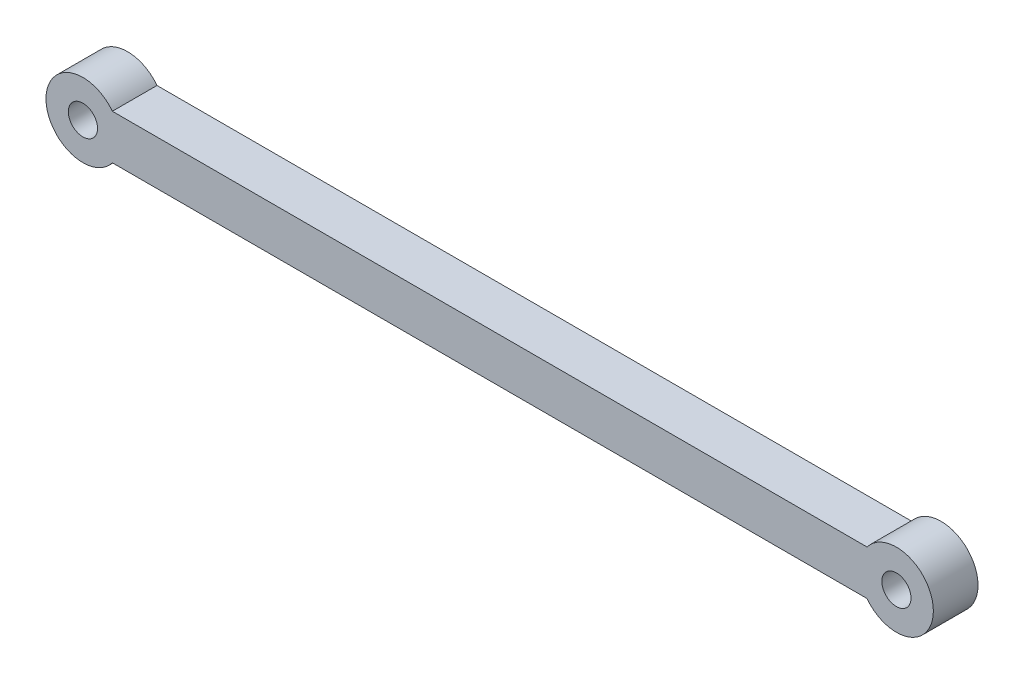
ISO-10303-21;
HEADER;
FILE_DESCRIPTION(('STEP AP214'),'2;1');
FILE_NAME('part.step','',(''),(''),'','','');
FILE_SCHEMA(('AUTOMOTIVE_DESIGN { 1 0 10303 214 1 1 1 1 }'));
ENDSEC;
DATA;
#1=APPLICATION_CONTEXT('core data for automotive mechanical design processes');
#2=APPLICATION_PROTOCOL_DEFINITION('international standard','automotive_design',2000,#1);
#3=PRODUCT_CONTEXT('',#1,'mechanical');
#4=PRODUCT('Part','Part','',(#3));
#5=PRODUCT_RELATED_PRODUCT_CATEGORY('part','',(#4));
#6=PRODUCT_DEFINITION_FORMATION('','',#4);
#7=PRODUCT_DEFINITION_CONTEXT('part definition',#1,'design');
#8=PRODUCT_DEFINITION('design','',#6,#7);
#9=PRODUCT_DEFINITION_SHAPE('','',#8);
#10=(LENGTH_UNIT() NAMED_UNIT(*) SI_UNIT(.MILLI.,.METRE.));
#11=(NAMED_UNIT(*) PLANE_ANGLE_UNIT() SI_UNIT($,.RADIAN.));
#12=(NAMED_UNIT(*) SI_UNIT($,.STERADIAN.) SOLID_ANGLE_UNIT());
#13=UNCERTAINTY_MEASURE_WITH_UNIT(LENGTH_MEASURE(1.E-05),#10,'distance_accuracy_value','');
#14=(GEOMETRIC_REPRESENTATION_CONTEXT(3) GLOBAL_UNCERTAINTY_ASSIGNED_CONTEXT((#13)) GLOBAL_UNIT_ASSIGNED_CONTEXT((#10,
#11,#12)) REPRESENTATION_CONTEXT('',''));
#15=CARTESIAN_POINT('',(0.,0.,0.));
#16=DIRECTION('',(0.,0.,1.));
#17=DIRECTION('',(1.,0.,0.));
#18=AXIS2_PLACEMENT_3D('',#15,#16,#17);
#19=CARTESIAN_POINT('',(-610.888476575822,10.97625,10.97625));
#20=DIRECTION('',(0.,1.,0.));
#21=DIRECTION('',(0.,0.,1.));
#22=AXIS2_PLACEMENT_3D('',#19,#20,#21);
#23=PLANE('',#22);
#24=DIRECTION('',(1.,0.,0.));
#25=VECTOR('',#24,1.);
#26=CARTESIAN_POINT('',(-610.888476575822,10.97625,-10.97625));
#27=LINE('',#26,#25);
#28=CARTESIAN_POINT('',(-610.888476575822,10.97625,-10.97625));
#29=VERTEX_POINT('',#28);
#30=CARTESIAN_POINT('',(-239.815748776291,10.97625,-10.97625));
#31=VERTEX_POINT('',#30);
#32=EDGE_CURVE('E141',#29,#31,#27,.T.);
#33=ORIENTED_EDGE('',*,*,#32,.F.);
#34=DIRECTION('',(0.,0.,-1.));
#35=VECTOR('',#34,1.);
#36=CARTESIAN_POINT('',(-610.888476575822,10.97625,10.97625));
#37=LINE('',#36,#35);
#38=CARTESIAN_POINT('',(-610.888476575822,10.97625,10.97625));
#39=VERTEX_POINT('',#38);
#40=EDGE_CURVE('E95',#39,#29,#37,.T.);
#41=ORIENTED_EDGE('',*,*,#40,.F.);
#42=DIRECTION('',(1.,0.,0.));
#43=VECTOR('',#42,1.);
#44=CARTESIAN_POINT('',(-610.888476575822,10.97625,10.97625));
#45=LINE('',#44,#43);
#46=CARTESIAN_POINT('',(-239.815748776291,10.97625,10.97625));
#47=VERTEX_POINT('',#46);
#48=EDGE_CURVE('E140',#39,#47,#45,.T.);
#49=ORIENTED_EDGE('',*,*,#48,.T.);
#50=DIRECTION('',(0.,0.,-1.));
#51=VECTOR('',#50,1.);
#52=CARTESIAN_POINT('',(-239.815748776291,10.97625,10.97625));
#53=LINE('',#52,#51);
#54=EDGE_CURVE('E108',#47,#31,#53,.T.);
#55=ORIENTED_EDGE('',*,*,#54,.T.);
#56=EDGE_LOOP('',(#33,#41,#49,#55));
#57=FACE_BOUND('',#56,.T.);
#58=ADVANCED_FACE('F75',(#57),#23,.T.);
#59=CARTESIAN_POINT('',(-610.888476575822,-10.97625,10.97625));
#60=DIRECTION('',(0.,1.,0.));
#61=DIRECTION('',(0.,0.,1.));
#62=AXIS2_PLACEMENT_3D('',#59,#60,#61);
#63=PLANE('',#62);
#64=DIRECTION('',(1.,0.,0.));
#65=VECTOR('',#64,1.);
#66=CARTESIAN_POINT('',(-610.888476575822,-10.97625,-10.97625));
#67=LINE('',#66,#65);
#68=CARTESIAN_POINT('',(-610.888476575822,-10.97625,-10.97625));
#69=VERTEX_POINT('',#68);
#70=CARTESIAN_POINT('',(-239.815748776291,-10.97625,-10.97625));
#71=VERTEX_POINT('',#70);
#72=EDGE_CURVE('E126',#69,#71,#67,.T.);
#73=ORIENTED_EDGE('',*,*,#72,.T.);
#74=DIRECTION('',(0.,0.,-1.));
#75=VECTOR('',#74,1.);
#76=CARTESIAN_POINT('',(-239.815748776291,-10.97625,10.97625));
#77=LINE('',#76,#75);
#78=CARTESIAN_POINT('',(-239.815748776291,-10.97625,10.97625));
#79=VERTEX_POINT('',#78);
#80=EDGE_CURVE('E86',#79,#71,#77,.T.);
#81=ORIENTED_EDGE('',*,*,#80,.F.);
#82=DIRECTION('',(1.,0.,0.));
#83=VECTOR('',#82,1.);
#84=CARTESIAN_POINT('',(-610.888476575822,-10.97625,10.97625));
#85=LINE('',#84,#83);
#86=CARTESIAN_POINT('',(-610.888476575822,-10.97625,10.97625));
#87=VERTEX_POINT('',#86);
#88=EDGE_CURVE('E124',#87,#79,#85,.T.);
#89=ORIENTED_EDGE('',*,*,#88,.F.);
#90=DIRECTION('',(0.,0.,-1.));
#91=VECTOR('',#90,1.);
#92=CARTESIAN_POINT('',(-610.888476575822,-10.97625,10.97625));
#93=LINE('',#92,#91);
#94=EDGE_CURVE('E12',#87,#69,#93,.T.);
#95=ORIENTED_EDGE('',*,*,#94,.T.);
#96=EDGE_LOOP('',(#73,#81,#89,#95));
#97=FACE_BOUND('',#96,.T.);
#98=ADVANCED_FACE('F122',(#97),#63,.F.);
#99=CARTESIAN_POINT('',(0.,0.,-10.97625));
#100=DIRECTION('',(0.,0.,1.));
#101=DIRECTION('',(1.,0.,0.));
#102=AXIS2_PLACEMENT_3D('',#99,#100,#101);
#103=PLANE('',#102);
#104=CARTESIAN_POINT('',(-625.352112676056,0.,-10.97625));
#105=DIRECTION('',(0.,0.,1.));
#106=DIRECTION('',(1.,0.,0.));
#107=AXIS2_PLACEMENT_3D('',#104,#105,#106);
#108=CIRCLE('',#107,7.1807);
#109=CARTESIAN_POINT('',(-618.171412676056,0.,-10.97625));
#110=VERTEX_POINT('',#109);
#111=EDGE_CURVE('E165',#110,#110,#108,.T.);
#112=ORIENTED_EDGE('',*,*,#111,.T.);
#113=EDGE_LOOP('',(#112));
#114=FACE_BOUND('',#113,.T.);
#115=CARTESIAN_POINT('',(-225.352112676056,0.,-10.97625));
#116=DIRECTION('',(0.,0.,1.));
#117=DIRECTION('',(1.,0.,0.));
#118=AXIS2_PLACEMENT_3D('',#115,#116,#117);
#119=CIRCLE('',#118,7.18069999999999);
#120=CARTESIAN_POINT('',(-218.171412676056,0.,-10.97625));
#121=VERTEX_POINT('',#120);
#122=EDGE_CURVE('E149',#121,#121,#119,.T.);
#123=ORIENTED_EDGE('',*,*,#122,.T.);
#124=EDGE_LOOP('',(#123));
#125=FACE_BOUND('',#124,.T.);
#126=ORIENTED_EDGE('',*,*,#72,.F.);
#127=CARTESIAN_POINT('',(-625.352112676056,0.,-10.97625));
#128=DIRECTION('',(0.,0.,1.));
#129=DIRECTION('',(1.,0.,0.));
#130=AXIS2_PLACEMENT_3D('',#127,#128,#129);
#131=CIRCLE('',#130,18.1569499999999);
#132=EDGE_CURVE('E136',#29,#69,#131,.T.);
#133=ORIENTED_EDGE('',*,*,#132,.F.);
#134=ORIENTED_EDGE('',*,*,#32,.T.);
#135=CARTESIAN_POINT('',(-225.352112676056,0.,-10.97625));
#136=DIRECTION('',(0.,0.,1.));
#137=DIRECTION('',(1.,0.,0.));
#138=AXIS2_PLACEMENT_3D('',#135,#136,#137);
#139=CIRCLE('',#138,18.1569499999999);
#140=EDGE_CURVE('E79',#71,#31,#139,.T.);
#141=ORIENTED_EDGE('',*,*,#140,.F.);
#142=EDGE_LOOP('',(#126,#133,#134,#141));
#143=FACE_BOUND('',#142,.T.);
#144=ADVANCED_FACE('F163',(#114,#125,#143),#103,.F.);
#145=CARTESIAN_POINT('',(0.,0.,10.97625));
#146=DIRECTION('',(0.,0.,1.));
#147=DIRECTION('',(1.,0.,0.));
#148=AXIS2_PLACEMENT_3D('',#145,#146,#147);
#149=PLANE('',#148);
#150=CARTESIAN_POINT('',(-625.352112676056,0.,10.97625));
#151=DIRECTION('',(0.,0.,1.));
#152=DIRECTION('',(1.,0.,0.));
#153=AXIS2_PLACEMENT_3D('',#150,#151,#152);
#154=CIRCLE('',#153,7.1807);
#155=CARTESIAN_POINT('',(-618.171412676056,0.,10.97625));
#156=VERTEX_POINT('',#155);
#157=EDGE_CURVE('E168',#156,#156,#154,.T.);
#158=ORIENTED_EDGE('',*,*,#157,.F.);
#159=EDGE_LOOP('',(#158));
#160=FACE_BOUND('',#159,.T.);
#161=CARTESIAN_POINT('',(-225.352112676056,0.,10.97625));
#162=DIRECTION('',(0.,0.,1.));
#163=DIRECTION('',(1.,0.,0.));
#164=AXIS2_PLACEMENT_3D('',#161,#162,#163);
#165=CIRCLE('',#164,7.18069999999999);
#166=CARTESIAN_POINT('',(-218.171412676056,0.,10.97625));
#167=VERTEX_POINT('',#166);
#168=EDGE_CURVE('E174',#167,#167,#165,.T.);
#169=ORIENTED_EDGE('',*,*,#168,.F.);
#170=EDGE_LOOP('',(#169));
#171=FACE_BOUND('',#170,.T.);
#172=ORIENTED_EDGE('',*,*,#48,.F.);
#173=CARTESIAN_POINT('',(-625.352112676056,0.,10.97625));
#174=DIRECTION('',(0.,0.,1.));
#175=DIRECTION('',(1.,0.,0.));
#176=AXIS2_PLACEMENT_3D('',#173,#174,#175);
#177=CIRCLE('',#176,18.1569499999999);
#178=EDGE_CURVE('E138',#39,#87,#177,.T.);
#179=ORIENTED_EDGE('',*,*,#178,.T.);
#180=ORIENTED_EDGE('',*,*,#88,.T.);
#181=CARTESIAN_POINT('',(-225.352112676056,0.,10.97625));
#182=DIRECTION('',(0.,0.,1.));
#183=DIRECTION('',(1.,0.,0.));
#184=AXIS2_PLACEMENT_3D('',#181,#182,#183);
#185=CIRCLE('',#184,18.1569499999999);
#186=EDGE_CURVE('E132',#79,#47,#185,.T.);
#187=ORIENTED_EDGE('',*,*,#186,.T.);
#188=EDGE_LOOP('',(#172,#179,#180,#187));
#189=FACE_BOUND('',#188,.T.);
#190=ADVANCED_FACE('F137',(#160,#171,#189),#149,.T.);
#191=CARTESIAN_POINT('',(-225.352112676056,0.,10.97625));
#192=DIRECTION('',(0.,0.,-1.));
#193=DIRECTION('',(-1.,0.,0.));
#194=AXIS2_PLACEMENT_3D('',#191,#192,#193);
#195=CYLINDRICAL_SURFACE('',#194,18.1569499999999);
#196=ORIENTED_EDGE('',*,*,#80,.T.);
#197=ORIENTED_EDGE('',*,*,#140,.T.);
#198=ORIENTED_EDGE('',*,*,#54,.F.);
#199=ORIENTED_EDGE('',*,*,#186,.F.);
#200=EDGE_LOOP('',(#196,#197,#198,#199));
#201=FACE_BOUND('',#200,.T.);
#202=ADVANCED_FACE('F77',(#201),#195,.T.);
#203=CARTESIAN_POINT('',(-625.352112676056,0.,10.97625));
#204=DIRECTION('',(0.,0.,-1.));
#205=DIRECTION('',(-1.,0.,0.));
#206=AXIS2_PLACEMENT_3D('',#203,#204,#205);
#207=CYLINDRICAL_SURFACE('',#206,18.1569499999999);
#208=ORIENTED_EDGE('',*,*,#132,.T.);
#209=ORIENTED_EDGE('',*,*,#94,.F.);
#210=ORIENTED_EDGE('',*,*,#178,.F.);
#211=ORIENTED_EDGE('',*,*,#40,.T.);
#212=EDGE_LOOP('',(#208,#209,#210,#211));
#213=FACE_BOUND('',#212,.T.);
#214=ADVANCED_FACE('F161',(#213),#207,.T.);
#215=CARTESIAN_POINT('',(-225.352112676056,0.,-10.97625));
#216=DIRECTION('',(0.,0.,1.));
#217=DIRECTION('',(1.,0.,0.));
#218=AXIS2_PLACEMENT_3D('',#215,#216,#217);
#219=CYLINDRICAL_SURFACE('',#218,7.18069999999999);
#220=CARTESIAN_POINT('',(-218.171412676056,0.,-10.97625));
#221=CARTESIAN_POINT('',(-218.171412676056,0.,-10.747578125));
#222=CARTESIAN_POINT('',(-218.171412676056,0.,-10.51890625));
#223=CARTESIAN_POINT('',(-218.171412676056,0.,-10.0615625));
#224=CARTESIAN_POINT('',(-218.171412676056,0.,-9.832890625));
#225=CARTESIAN_POINT('',(-218.171412676056,0.,-9.375546875));
#226=CARTESIAN_POINT('',(-218.171412676056,0.,-9.146875));
#227=CARTESIAN_POINT('',(-218.171412676056,0.,-8.68953125));
#228=CARTESIAN_POINT('',(-218.171412676056,0.,-8.460859375));
#229=CARTESIAN_POINT('',(-218.171412676056,0.,-8.003515625));
#230=CARTESIAN_POINT('',(-218.171412676056,0.,-7.77484375));
#231=CARTESIAN_POINT('',(-218.171412676056,0.,-7.3175));
#232=CARTESIAN_POINT('',(-218.171412676056,0.,-7.088828125));
#233=CARTESIAN_POINT('',(-218.171412676056,0.,-6.631484375));
#234=CARTESIAN_POINT('',(-218.171412676056,0.,-6.4028125));
#235=CARTESIAN_POINT('',(-218.171412676056,0.,-5.94546875));
#236=CARTESIAN_POINT('',(-218.171412676056,0.,-5.716796875));
#237=CARTESIAN_POINT('',(-218.171412676056,0.,-5.259453125));
#238=CARTESIAN_POINT('',(-218.171412676056,0.,-5.03078125));
#239=CARTESIAN_POINT('',(-218.171412676056,0.,-4.5734375));
#240=CARTESIAN_POINT('',(-218.171412676056,0.,-4.344765625));
#241=CARTESIAN_POINT('',(-218.171412676056,0.,-3.887421875));
#242=CARTESIAN_POINT('',(-218.171412676056,0.,-3.65875));
#243=CARTESIAN_POINT('',(-218.171412676056,0.,-3.20140625));
#244=CARTESIAN_POINT('',(-218.171412676056,0.,-2.972734375));
#245=CARTESIAN_POINT('',(-218.171412676056,0.,-2.515390625));
#246=CARTESIAN_POINT('',(-218.171412676056,0.,-2.28671875));
#247=CARTESIAN_POINT('',(-218.171412676056,0.,-1.829375));
#248=CARTESIAN_POINT('',(-218.171412676056,0.,-1.600703125));
#249=CARTESIAN_POINT('',(-218.171412676056,0.,-1.143359375));
#250=CARTESIAN_POINT('',(-218.171412676056,0.,-0.914687500000001));
#251=CARTESIAN_POINT('',(-218.171412676056,0.,-0.457343750000001));
#252=CARTESIAN_POINT('',(-218.171412676056,0.,-0.228671875000002));
#253=CARTESIAN_POINT('',(-218.171412676056,0.,0.228671874999998));
#254=CARTESIAN_POINT('',(-218.171412676056,0.,0.457343749999998));
#255=CARTESIAN_POINT('',(-218.171412676056,0.,0.914687499999998));
#256=CARTESIAN_POINT('',(-218.171412676056,0.,1.143359375));
#257=CARTESIAN_POINT('',(-218.171412676056,0.,1.600703125));
#258=CARTESIAN_POINT('',(-218.171412676056,0.,1.829375));
#259=CARTESIAN_POINT('',(-218.171412676056,0.,2.28671875));
#260=CARTESIAN_POINT('',(-218.171412676056,0.,2.515390625));
#261=CARTESIAN_POINT('',(-218.171412676056,0.,2.972734375));
#262=CARTESIAN_POINT('',(-218.171412676056,0.,3.20140625));
#263=CARTESIAN_POINT('',(-218.171412676056,0.,3.65875));
#264=CARTESIAN_POINT('',(-218.171412676056,0.,3.887421875));
#265=CARTESIAN_POINT('',(-218.171412676056,0.,4.344765625));
#266=CARTESIAN_POINT('',(-218.171412676056,0.,4.5734375));
#267=CARTESIAN_POINT('',(-218.171412676056,0.,5.03078125));
#268=CARTESIAN_POINT('',(-218.171412676056,0.,5.259453125));
#269=CARTESIAN_POINT('',(-218.171412676056,0.,5.716796875));
#270=CARTESIAN_POINT('',(-218.171412676056,0.,5.94546875));
#271=CARTESIAN_POINT('',(-218.171412676056,0.,6.4028125));
#272=CARTESIAN_POINT('',(-218.171412676056,0.,6.631484375));
#273=CARTESIAN_POINT('',(-218.171412676056,0.,7.088828125));
#274=CARTESIAN_POINT('',(-218.171412676056,0.,7.3175));
#275=CARTESIAN_POINT('',(-218.171412676056,0.,7.77484375));
#276=CARTESIAN_POINT('',(-218.171412676056,0.,8.003515625));
#277=CARTESIAN_POINT('',(-218.171412676056,0.,8.460859375));
#278=CARTESIAN_POINT('',(-218.171412676056,0.,8.68953125));
#279=CARTESIAN_POINT('',(-218.171412676056,0.,9.146875));
#280=CARTESIAN_POINT('',(-218.171412676056,0.,9.375546875));
#281=CARTESIAN_POINT('',(-218.171412676056,0.,9.832890625));
#282=CARTESIAN_POINT('',(-218.171412676056,0.,10.0615625));
#283=CARTESIAN_POINT('',(-218.171412676056,0.,10.51890625));
#284=CARTESIAN_POINT('',(-218.171412676056,0.,10.747578125));
#285=CARTESIAN_POINT('',(-218.171412676056,0.,10.97625));
#286=B_SPLINE_CURVE_WITH_KNOTS('',3,(#220,#221,#222,#223,#224,#225,#226,#227,#228,#229,#230,
#231,#232,#233,#234,#235,#236,#237,#238,#239,#240,#241,#242,#243,#244,#245,#246,#247,#248,#249,
#250,#251,#252,#253,#254,#255,#256,#257,#258,#259,#260,#261,#262,#263,#264,#265,#266,#267,#268,
#269,#270,#271,#272,#273,#274,#275,#276,#277,#278,#279,#280,#281,#282,#283,#284,#285),
.UNSPECIFIED.,.F.,.F.,(4,2,2,2,2,2,2,2,2,2,2,2,2,2,2,2,2,2,2,2,2,2,2,2,2,2,2,2,2,2,2,2,4),(0.,
0.686015625,1.37203125,2.058046875,2.7440625,3.430078125,4.11609375,4.802109375,5.488125,
6.174140625,6.86015625,7.546171875,8.2321875,8.918203125,9.60421875,10.290234375,10.97625,
11.662265625,12.34828125,13.034296875,13.7203125,14.406328125,15.09234375,15.778359375,
16.464375,17.150390625,17.83640625,18.522421875,19.2084375,19.894453125,20.58046875,
21.266484375,21.9525),.UNSPECIFIED.);
#287=EDGE_CURVE('BSEAM185',#121,#167,#286,.T.);
#288=ORIENTED_EDGE('',*,*,#122,.F.);
#289=ORIENTED_EDGE('',*,*,#168,.T.);
#290=ORIENTED_EDGE('',*,*,#287,.T.);
#291=ORIENTED_EDGE('',*,*,#287,.F.);
#292=EDGE_LOOP('',(#288,#290,#289,#291));
#293=FACE_BOUND('',#292,.T.);
#294=ADVANCED_FACE('F185',(#293),#219,.F.);
#295=CARTESIAN_POINT('',(-625.352112676056,0.,-10.97625));
#296=DIRECTION('',(0.,0.,1.));
#297=DIRECTION('',(1.,0.,0.));
#298=AXIS2_PLACEMENT_3D('',#295,#296,#297);
#299=CYLINDRICAL_SURFACE('',#298,7.1807);
#300=CARTESIAN_POINT('',(-618.171412676056,0.,-10.97625));
#301=CARTESIAN_POINT('',(-618.171412676056,0.,-10.747578125));
#302=CARTESIAN_POINT('',(-618.171412676056,0.,-10.51890625));
#303=CARTESIAN_POINT('',(-618.171412676056,0.,-10.0615625));
#304=CARTESIAN_POINT('',(-618.171412676056,0.,-9.832890625));
#305=CARTESIAN_POINT('',(-618.171412676056,0.,-9.375546875));
#306=CARTESIAN_POINT('',(-618.171412676056,0.,-9.146875));
#307=CARTESIAN_POINT('',(-618.171412676056,0.,-8.68953125));
#308=CARTESIAN_POINT('',(-618.171412676056,0.,-8.460859375));
#309=CARTESIAN_POINT('',(-618.171412676056,0.,-8.003515625));
#310=CARTESIAN_POINT('',(-618.171412676056,0.,-7.77484375));
#311=CARTESIAN_POINT('',(-618.171412676056,0.,-7.3175));
#312=CARTESIAN_POINT('',(-618.171412676056,0.,-7.088828125));
#313=CARTESIAN_POINT('',(-618.171412676056,0.,-6.631484375));
#314=CARTESIAN_POINT('',(-618.171412676056,0.,-6.4028125));
#315=CARTESIAN_POINT('',(-618.171412676056,0.,-5.94546875));
#316=CARTESIAN_POINT('',(-618.171412676056,0.,-5.716796875));
#317=CARTESIAN_POINT('',(-618.171412676056,0.,-5.259453125));
#318=CARTESIAN_POINT('',(-618.171412676056,0.,-5.03078125));
#319=CARTESIAN_POINT('',(-618.171412676056,0.,-4.5734375));
#320=CARTESIAN_POINT('',(-618.171412676056,0.,-4.344765625));
#321=CARTESIAN_POINT('',(-618.171412676056,0.,-3.887421875));
#322=CARTESIAN_POINT('',(-618.171412676056,0.,-3.65875));
#323=CARTESIAN_POINT('',(-618.171412676056,0.,-3.20140625));
#324=CARTESIAN_POINT('',(-618.171412676056,0.,-2.972734375));
#325=CARTESIAN_POINT('',(-618.171412676056,0.,-2.515390625));
#326=CARTESIAN_POINT('',(-618.171412676056,0.,-2.28671875));
#327=CARTESIAN_POINT('',(-618.171412676056,0.,-1.829375));
#328=CARTESIAN_POINT('',(-618.171412676056,0.,-1.600703125));
#329=CARTESIAN_POINT('',(-618.171412676056,0.,-1.143359375));
#330=CARTESIAN_POINT('',(-618.171412676056,0.,-0.914687500000001));
#331=CARTESIAN_POINT('',(-618.171412676056,0.,-0.457343750000001));
#332=CARTESIAN_POINT('',(-618.171412676056,0.,-0.228671875000002));
#333=CARTESIAN_POINT('',(-618.171412676056,0.,0.228671874999998));
#334=CARTESIAN_POINT('',(-618.171412676056,0.,0.457343749999998));
#335=CARTESIAN_POINT('',(-618.171412676056,0.,0.914687499999998));
#336=CARTESIAN_POINT('',(-618.171412676056,0.,1.143359375));
#337=CARTESIAN_POINT('',(-618.171412676056,0.,1.600703125));
#338=CARTESIAN_POINT('',(-618.171412676056,0.,1.829375));
#339=CARTESIAN_POINT('',(-618.171412676056,0.,2.28671875));
#340=CARTESIAN_POINT('',(-618.171412676056,0.,2.515390625));
#341=CARTESIAN_POINT('',(-618.171412676056,0.,2.972734375));
#342=CARTESIAN_POINT('',(-618.171412676056,0.,3.20140625));
#343=CARTESIAN_POINT('',(-618.171412676056,0.,3.65875));
#344=CARTESIAN_POINT('',(-618.171412676056,0.,3.887421875));
#345=CARTESIAN_POINT('',(-618.171412676056,0.,4.344765625));
#346=CARTESIAN_POINT('',(-618.171412676056,0.,4.5734375));
#347=CARTESIAN_POINT('',(-618.171412676056,0.,5.03078125));
#348=CARTESIAN_POINT('',(-618.171412676056,0.,5.259453125));
#349=CARTESIAN_POINT('',(-618.171412676056,0.,5.716796875));
#350=CARTESIAN_POINT('',(-618.171412676056,0.,5.94546875));
#351=CARTESIAN_POINT('',(-618.171412676056,0.,6.4028125));
#352=CARTESIAN_POINT('',(-618.171412676056,0.,6.631484375));
#353=CARTESIAN_POINT('',(-618.171412676056,0.,7.088828125));
#354=CARTESIAN_POINT('',(-618.171412676056,0.,7.3175));
#355=CARTESIAN_POINT('',(-618.171412676056,0.,7.77484375));
#356=CARTESIAN_POINT('',(-618.171412676056,0.,8.003515625));
#357=CARTESIAN_POINT('',(-618.171412676056,0.,8.460859375));
#358=CARTESIAN_POINT('',(-618.171412676056,0.,8.68953125));
#359=CARTESIAN_POINT('',(-618.171412676056,0.,9.146875));
#360=CARTESIAN_POINT('',(-618.171412676056,0.,9.375546875));
#361=CARTESIAN_POINT('',(-618.171412676056,0.,9.832890625));
#362=CARTESIAN_POINT('',(-618.171412676056,0.,10.0615625));
#363=CARTESIAN_POINT('',(-618.171412676056,0.,10.51890625));
#364=CARTESIAN_POINT('',(-618.171412676056,0.,10.747578125));
#365=CARTESIAN_POINT('',(-618.171412676056,0.,10.97625));
#366=B_SPLINE_CURVE_WITH_KNOTS('',3,(#300,#301,#302,#303,#304,#305,#306,#307,#308,#309,#310,
#311,#312,#313,#314,#315,#316,#317,#318,#319,#320,#321,#322,#323,#324,#325,#326,#327,#328,#329,
#330,#331,#332,#333,#334,#335,#336,#337,#338,#339,#340,#341,#342,#343,#344,#345,#346,#347,#348,
#349,#350,#351,#352,#353,#354,#355,#356,#357,#358,#359,#360,#361,#362,#363,#364,#365),
.UNSPECIFIED.,.F.,.F.,(4,2,2,2,2,2,2,2,2,2,2,2,2,2,2,2,2,2,2,2,2,2,2,2,2,2,2,2,2,2,2,2,4),(0.,
0.686015625,1.37203125,2.058046875,2.7440625,3.430078125,4.11609375,4.802109375,5.488125,
6.174140625,6.86015625,7.546171875,8.2321875,8.918203125,9.60421875,10.290234375,10.97625,
11.662265625,12.34828125,13.034296875,13.7203125,14.406328125,15.09234375,15.778359375,
16.464375,17.150390625,17.83640625,18.522421875,19.2084375,19.894453125,20.58046875,
21.266484375,21.9525),.UNSPECIFIED.);
#367=EDGE_CURVE('BSEAM187',#110,#156,#366,.T.);
#368=ORIENTED_EDGE('',*,*,#111,.F.);
#369=ORIENTED_EDGE('',*,*,#157,.T.);
#370=ORIENTED_EDGE('',*,*,#367,.T.);
#371=ORIENTED_EDGE('',*,*,#367,.F.);
#372=EDGE_LOOP('',(#368,#370,#369,#371));
#373=FACE_BOUND('',#372,.T.);
#374=ADVANCED_FACE('F187',(#373),#299,.F.);
#375=CLOSED_SHELL('',(#58,#98,#144,#190,#202,#214,#294,#374));
#376=MANIFOLD_SOLID_BREP('B2',#375);
#377=ADVANCED_BREP_SHAPE_REPRESENTATION('',(#18,#376),#14);
#378=SHAPE_DEFINITION_REPRESENTATION(#9,#377);
ENDSEC;
END-ISO-10303-21;
